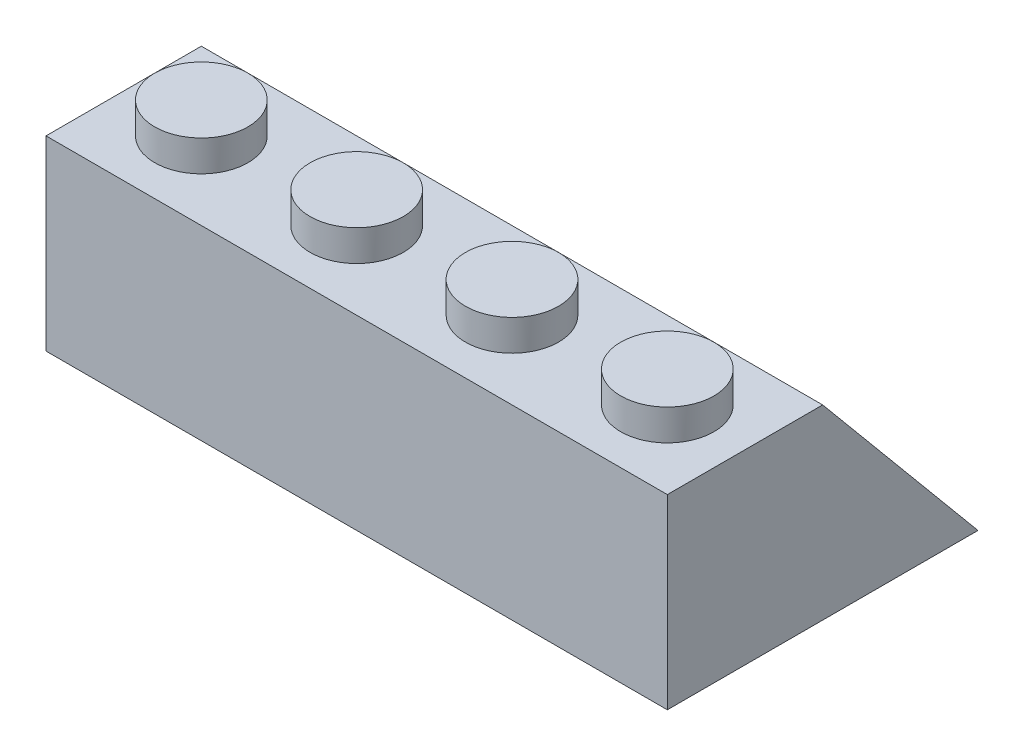
ISO-10303-21;
HEADER;
FILE_DESCRIPTION(('STEP AP214'),'2;1');
FILE_NAME('part.step','',(''),(''),'','','');
FILE_SCHEMA(('AUTOMOTIVE_DESIGN { 1 0 10303 214 1 1 1 1 }'));
ENDSEC;
DATA;
#1=APPLICATION_CONTEXT('core data for automotive mechanical design processes');
#2=APPLICATION_PROTOCOL_DEFINITION('international standard','automotive_design',2000,#1);
#3=PRODUCT_CONTEXT('',#1,'mechanical');
#4=PRODUCT('Part','Part','',(#3));
#5=PRODUCT_RELATED_PRODUCT_CATEGORY('part','',(#4));
#6=PRODUCT_DEFINITION_FORMATION('','',#4);
#7=PRODUCT_DEFINITION_CONTEXT('part definition',#1,'design');
#8=PRODUCT_DEFINITION('design','',#6,#7);
#9=PRODUCT_DEFINITION_SHAPE('','',#8);
#10=(LENGTH_UNIT() NAMED_UNIT(*) SI_UNIT(.MILLI.,.METRE.));
#11=(NAMED_UNIT(*) PLANE_ANGLE_UNIT() SI_UNIT($,.RADIAN.));
#12=(NAMED_UNIT(*) SI_UNIT($,.STERADIAN.) SOLID_ANGLE_UNIT());
#13=UNCERTAINTY_MEASURE_WITH_UNIT(LENGTH_MEASURE(1.E-05),#10,'distance_accuracy_value','');
#14=(GEOMETRIC_REPRESENTATION_CONTEXT(3) GLOBAL_UNCERTAINTY_ASSIGNED_CONTEXT((#13)) GLOBAL_UNIT_ASSIGNED_CONTEXT((#10,
#11,#12)) REPRESENTATION_CONTEXT('',''));
#15=CARTESIAN_POINT('',(0.,0.,0.));
#16=DIRECTION('',(0.,0.,1.));
#17=DIRECTION('',(1.,0.,0.));
#18=AXIS2_PLACEMENT_3D('',#15,#16,#17);
#19=CARTESIAN_POINT('',(32.,0.,0.));
#20=DIRECTION('',(0.,1.,0.));
#21=DIRECTION('',(0.,0.,1.));
#22=AXIS2_PLACEMENT_3D('',#19,#20,#21);
#23=PLANE('',#22);
#24=DIRECTION('',(0.,0.,-1.));
#25=VECTOR('',#24,1.);
#26=CARTESIAN_POINT('',(0.,0.,0.));
#27=LINE('',#26,#25);
#28=CARTESIAN_POINT('',(0.,0.,0.));
#29=VERTEX_POINT('',#28);
#30=CARTESIAN_POINT('',(0.,0.,-16.));
#31=VERTEX_POINT('',#30);
#32=EDGE_CURVE('E198',#29,#31,#27,.T.);
#33=ORIENTED_EDGE('',*,*,#32,.T.);
#34=DIRECTION('',(-1.,0.,0.));
#35=VECTOR('',#34,1.);
#36=CARTESIAN_POINT('',(32.,0.,-16.));
#37=LINE('',#36,#35);
#38=CARTESIAN_POINT('',(32.,0.,-16.));
#39=VERTEX_POINT('',#38);
#40=EDGE_CURVE('E211',#39,#31,#37,.T.);
#41=ORIENTED_EDGE('',*,*,#40,.F.);
#42=DIRECTION('',(0.,0.,-1.));
#43=VECTOR('',#42,1.);
#44=CARTESIAN_POINT('',(32.,0.,0.));
#45=LINE('',#44,#43);
#46=CARTESIAN_POINT('',(32.,0.,0.));
#47=VERTEX_POINT('',#46);
#48=EDGE_CURVE('E92',#47,#39,#45,.T.);
#49=ORIENTED_EDGE('',*,*,#48,.F.);
#50=DIRECTION('',(-1.,0.,0.));
#51=VECTOR('',#50,1.);
#52=CARTESIAN_POINT('',(32.,0.,0.));
#53=LINE('',#52,#51);
#54=EDGE_CURVE('E215',#47,#29,#53,.T.);
#55=ORIENTED_EDGE('',*,*,#54,.T.);
#56=EDGE_LOOP('',(#33,#41,#49,#55));
#57=FACE_BOUND('',#56,.T.);
#58=DIRECTION('',(0.,0.,-1.));
#59=VECTOR('',#58,1.);
#60=CARTESIAN_POINT('',(1.6,0.,0.));
#61=LINE('',#60,#59);
#62=CARTESIAN_POINT('',(1.6,0.,-1.6));
#63=VERTEX_POINT('',#62);
#64=CARTESIAN_POINT('',(1.6,0.,-13.9172667530916));
#65=VERTEX_POINT('',#64);
#66=EDGE_CURVE('E140',#63,#65,#61,.T.);
#67=ORIENTED_EDGE('',*,*,#66,.F.);
#68=DIRECTION('',(-1.,0.,0.));
#69=VECTOR('',#68,1.);
#70=CARTESIAN_POINT('',(32.,0.,-1.6));
#71=LINE('',#70,#69);
#72=CARTESIAN_POINT('',(30.4,0.,-1.6));
#73=VERTEX_POINT('',#72);
#74=EDGE_CURVE('E138',#73,#63,#71,.T.);
#75=ORIENTED_EDGE('',*,*,#74,.F.);
#76=DIRECTION('',(0.,0.,-1.));
#77=VECTOR('',#76,1.);
#78=CARTESIAN_POINT('',(30.4,0.,0.));
#79=LINE('',#78,#77);
#80=CARTESIAN_POINT('',(30.4,0.,-13.9172667530916));
#81=VERTEX_POINT('',#80);
#82=EDGE_CURVE('E155',#73,#81,#79,.T.);
#83=ORIENTED_EDGE('',*,*,#82,.T.);
#84=DIRECTION('',(-1.,0.,0.));
#85=VECTOR('',#84,1.);
#86=CARTESIAN_POINT('',(32.,0.,-13.9172667530916));
#87=LINE('',#86,#85);
#88=EDGE_CURVE('E166',#81,#65,#87,.T.);
#89=ORIENTED_EDGE('',*,*,#88,.T.);
#90=EDGE_LOOP('',(#67,#75,#83,#89));
#91=FACE_BOUND('',#90,.T.);
#92=ADVANCED_FACE('F38',(#57,#91),#23,.F.);
#93=CARTESIAN_POINT('',(28.,11.2,-4.));
#94=DIRECTION('',(0.,1.,0.));
#95=DIRECTION('',(0.,0.,1.));
#96=AXIS2_PLACEMENT_3D('',#93,#94,#95);
#97=PLANE('',#96);
#98=CARTESIAN_POINT('',(28.,11.2,-4.));
#99=DIRECTION('',(0.,1.,0.));
#100=DIRECTION('',(0.,0.,1.));
#101=AXIS2_PLACEMENT_3D('',#98,#99,#100);
#102=CIRCLE('',#101,2.4);
#103=CARTESIAN_POINT('',(28.,11.2,-1.6));
#104=VERTEX_POINT('',#103);
#105=EDGE_CURVE('E11',#104,#104,#102,.T.);
#106=ORIENTED_EDGE('',*,*,#105,.T.);
#107=EDGE_LOOP('',(#106));
#108=FACE_BOUND('',#107,.T.);
#109=ADVANCED_FACE('F40',(#108),#97,.T.);
#110=CARTESIAN_POINT('',(28.,11.2,-4.));
#111=DIRECTION('',(0.,-1.,0.));
#112=DIRECTION('',(0.,0.,-1.));
#113=AXIS2_PLACEMENT_3D('',#110,#111,#112);
#114=CYLINDRICAL_SURFACE('',#113,2.4);
#115=ORIENTED_EDGE('',*,*,#105,.F.);
#116=EDGE_LOOP('',(#115));
#117=FACE_BOUND('',#116,.T.);
#118=CARTESIAN_POINT('',(28.,9.6,-4.));
#119=DIRECTION('',(0.,-1.,0.));
#120=DIRECTION('',(0.,0.,-1.));
#121=AXIS2_PLACEMENT_3D('',#118,#119,#120);
#122=CIRCLE('',#121,2.4);
#123=CARTESIAN_POINT('',(28.,9.6,-6.4));
#124=VERTEX_POINT('',#123);
#125=EDGE_CURVE('E47',#124,#124,#122,.F.);
#126=ORIENTED_EDGE('',*,*,#125,.T.);
#127=EDGE_LOOP('',(#126));
#128=FACE_BOUND('',#127,.T.);
#129=ADVANCED_FACE('F237',(#117,#128),#114,.T.);
#130=CARTESIAN_POINT('',(20.,11.2,-4.));
#131=DIRECTION('',(0.,1.,0.));
#132=DIRECTION('',(0.,0.,1.));
#133=AXIS2_PLACEMENT_3D('',#130,#131,#132);
#134=PLANE('',#133);
#135=CARTESIAN_POINT('',(20.,11.2,-4.));
#136=DIRECTION('',(0.,1.,0.));
#137=DIRECTION('',(0.,0.,1.));
#138=AXIS2_PLACEMENT_3D('',#135,#136,#137);
#139=CIRCLE('',#138,2.4);
#140=CARTESIAN_POINT('',(20.,11.2,-1.6));
#141=VERTEX_POINT('',#140);
#142=EDGE_CURVE('E230',#141,#141,#139,.T.);
#143=ORIENTED_EDGE('',*,*,#142,.T.);
#144=EDGE_LOOP('',(#143));
#145=FACE_BOUND('',#144,.T.);
#146=ADVANCED_FACE('F273',(#145),#134,.T.);
#147=CARTESIAN_POINT('',(20.,11.2,-4.));
#148=DIRECTION('',(0.,-1.,0.));
#149=DIRECTION('',(0.,0.,-1.));
#150=AXIS2_PLACEMENT_3D('',#147,#148,#149);
#151=CYLINDRICAL_SURFACE('',#150,2.4);
#152=ORIENTED_EDGE('',*,*,#142,.F.);
#153=EDGE_LOOP('',(#152));
#154=FACE_BOUND('',#153,.T.);
#155=CARTESIAN_POINT('',(20.,9.6,-4.));
#156=DIRECTION('',(0.,-1.,0.));
#157=DIRECTION('',(0.,0.,-1.));
#158=AXIS2_PLACEMENT_3D('',#155,#156,#157);
#159=CIRCLE('',#158,2.4);
#160=CARTESIAN_POINT('',(20.,9.6,-6.4));
#161=VERTEX_POINT('',#160);
#162=EDGE_CURVE('E226',#161,#161,#159,.F.);
#163=ORIENTED_EDGE('',*,*,#162,.T.);
#164=EDGE_LOOP('',(#163));
#165=FACE_BOUND('',#164,.T.);
#166=ADVANCED_FACE('F269',(#154,#165),#151,.T.);
#167=CARTESIAN_POINT('',(32.,9.6,0.));
#168=DIRECTION('',(0.,0.,-1.));
#169=DIRECTION('',(-1.,0.,0.));
#170=AXIS2_PLACEMENT_3D('',#167,#168,#169);
#171=PLANE('',#170);
#172=DIRECTION('',(0.,-1.,0.));
#173=VECTOR('',#172,1.);
#174=CARTESIAN_POINT('',(0.,9.6,0.));
#175=LINE('',#174,#173);
#176=CARTESIAN_POINT('',(0.,9.6,0.));
#177=VERTEX_POINT('',#176);
#178=EDGE_CURVE('E183',#177,#29,#175,.T.);
#179=ORIENTED_EDGE('',*,*,#178,.T.);
#180=ORIENTED_EDGE('',*,*,#54,.F.);
#181=DIRECTION('',(0.,-1.,0.));
#182=VECTOR('',#181,1.);
#183=CARTESIAN_POINT('',(32.,9.6,0.));
#184=LINE('',#183,#182);
#185=CARTESIAN_POINT('',(32.,9.6,0.));
#186=VERTEX_POINT('',#185);
#187=EDGE_CURVE('E184',#186,#47,#184,.T.);
#188=ORIENTED_EDGE('',*,*,#187,.F.);
#189=DIRECTION('',(-1.,0.,0.));
#190=VECTOR('',#189,1.);
#191=CARTESIAN_POINT('',(32.,9.6,0.));
#192=LINE('',#191,#190);
#193=EDGE_CURVE('E194',#186,#177,#192,.T.);
#194=ORIENTED_EDGE('',*,*,#193,.T.);
#195=EDGE_LOOP('',(#179,#180,#188,#194));
#196=FACE_BOUND('',#195,.T.);
#197=ADVANCED_FACE('F251',(#196),#171,.F.);
#198=CARTESIAN_POINT('',(32.,9.6,-8.));
#199=DIRECTION('',(0.,-0.64018439966448,0.768221279597376));
#200=DIRECTION('',(0.,-0.768221279597376,-0.64018439966448));
#201=AXIS2_PLACEMENT_3D('',#198,#199,#200);
#202=PLANE('',#201);
#203=DIRECTION('',(0.,0.768221279597376,0.64018439966448));
#204=VECTOR('',#203,1.);
#205=CARTESIAN_POINT('',(0.,9.6,-8.));
#206=LINE('',#205,#204);
#207=CARTESIAN_POINT('',(0.,9.6,-8.));
#208=VERTEX_POINT('',#207);
#209=EDGE_CURVE('E201',#31,#208,#206,.T.);
#210=ORIENTED_EDGE('',*,*,#209,.T.);
#211=DIRECTION('',(-1.,0.,0.));
#212=VECTOR('',#211,1.);
#213=CARTESIAN_POINT('',(32.,9.6,-8.));
#214=LINE('',#213,#212);
#215=CARTESIAN_POINT('',(32.,9.6,-8.));
#216=VERTEX_POINT('',#215);
#217=EDGE_CURVE('E208',#216,#208,#214,.T.);
#218=ORIENTED_EDGE('',*,*,#217,.F.);
#219=DIRECTION('',(0.,0.768221279597376,0.64018439966448));
#220=VECTOR('',#219,1.);
#221=CARTESIAN_POINT('',(32.,9.6,-8.));
#222=LINE('',#221,#220);
#223=EDGE_CURVE('E189',#39,#216,#222,.T.);
#224=ORIENTED_EDGE('',*,*,#223,.F.);
#225=ORIENTED_EDGE('',*,*,#40,.T.);
#226=EDGE_LOOP('',(#210,#218,#224,#225));
#227=FACE_BOUND('',#226,.T.);
#228=ADVANCED_FACE('F242',(#227),#202,.F.);
#229=CARTESIAN_POINT('',(32.,9.6,-8.));
#230=DIRECTION('',(0.,-1.,0.));
#231=DIRECTION('',(0.,0.,-1.));
#232=AXIS2_PLACEMENT_3D('',#229,#230,#231);
#233=PLANE('',#232);
#234=CARTESIAN_POINT('',(12.,9.6,-4.));
#235=DIRECTION('',(0.,-1.,0.));
#236=DIRECTION('',(0.,0.,-1.));
#237=AXIS2_PLACEMENT_3D('',#234,#235,#236);
#238=CIRCLE('',#237,2.4);
#239=CARTESIAN_POINT('',(12.,9.6,-6.4));
#240=VERTEX_POINT('',#239);
#241=EDGE_CURVE('E222',#240,#240,#238,.F.);
#242=ORIENTED_EDGE('',*,*,#241,.F.);
#243=EDGE_LOOP('',(#242));
#244=FACE_BOUND('',#243,.T.);
#245=CARTESIAN_POINT('',(4.,9.6,-4.));
#246=DIRECTION('',(0.,-1.,0.));
#247=DIRECTION('',(0.,0.,-1.));
#248=AXIS2_PLACEMENT_3D('',#245,#246,#247);
#249=CIRCLE('',#248,2.4);
#250=CARTESIAN_POINT('',(4.,9.6,-6.4));
#251=VERTEX_POINT('',#250);
#252=EDGE_CURVE('E218',#251,#251,#249,.F.);
#253=ORIENTED_EDGE('',*,*,#252,.F.);
#254=EDGE_LOOP('',(#253));
#255=FACE_BOUND('',#254,.T.);
#256=DIRECTION('',(0.,0.,1.));
#257=VECTOR('',#256,1.);
#258=CARTESIAN_POINT('',(0.,9.6,-8.));
#259=LINE('',#258,#257);
#260=EDGE_CURVE('E84',#208,#177,#259,.T.);
#261=ORIENTED_EDGE('',*,*,#260,.T.);
#262=ORIENTED_EDGE('',*,*,#193,.F.);
#263=DIRECTION('',(0.,0.,1.));
#264=VECTOR('',#263,1.);
#265=CARTESIAN_POINT('',(32.,9.6,-8.));
#266=LINE('',#265,#264);
#267=EDGE_CURVE('E63',#216,#186,#266,.T.);
#268=ORIENTED_EDGE('',*,*,#267,.F.);
#269=ORIENTED_EDGE('',*,*,#217,.T.);
#270=EDGE_LOOP('',(#261,#262,#268,#269));
#271=FACE_BOUND('',#270,.T.);
#272=ORIENTED_EDGE('',*,*,#162,.F.);
#273=EDGE_LOOP('',(#272));
#274=FACE_BOUND('',#273,.T.);
#275=ORIENTED_EDGE('',*,*,#125,.F.);
#276=EDGE_LOOP('',(#275));
#277=FACE_BOUND('',#276,.T.);
#278=ADVANCED_FACE('F239',(#244,#255,#271,#274,#277),#233,.F.);
#279=CARTESIAN_POINT('',(32.,0.,0.));
#280=DIRECTION('',(1.,0.,0.));
#281=DIRECTION('',(0.,0.,-1.));
#282=AXIS2_PLACEMENT_3D('',#279,#280,#281);
#283=PLANE('',#282);
#284=ORIENTED_EDGE('',*,*,#187,.T.);
#285=ORIENTED_EDGE('',*,*,#48,.T.);
#286=ORIENTED_EDGE('',*,*,#223,.T.);
#287=ORIENTED_EDGE('',*,*,#267,.T.);
#288=EDGE_LOOP('',(#284,#285,#286,#287));
#289=FACE_BOUND('',#288,.T.);
#290=ADVANCED_FACE('F241',(#289),#283,.T.);
#291=CARTESIAN_POINT('',(0.,0.,0.));
#292=DIRECTION('',(1.,0.,0.));
#293=DIRECTION('',(0.,0.,-1.));
#294=AXIS2_PLACEMENT_3D('',#291,#292,#293);
#295=PLANE('',#294);
#296=ORIENTED_EDGE('',*,*,#178,.F.);
#297=ORIENTED_EDGE('',*,*,#260,.F.);
#298=ORIENTED_EDGE('',*,*,#209,.F.);
#299=ORIENTED_EDGE('',*,*,#32,.F.);
#300=EDGE_LOOP('',(#296,#297,#298,#299));
#301=FACE_BOUND('',#300,.T.);
#302=ADVANCED_FACE('F249',(#301),#295,.F.);
#303=CARTESIAN_POINT('',(4.,11.2,-4.));
#304=DIRECTION('',(0.,-1.,0.));
#305=DIRECTION('',(0.,0.,-1.));
#306=AXIS2_PLACEMENT_3D('',#303,#304,#305);
#307=CYLINDRICAL_SURFACE('',#306,2.4);
#308=CARTESIAN_POINT('',(4.,11.2,-4.));
#309=DIRECTION('',(0.,1.,0.));
#310=DIRECTION('',(0.,0.,1.));
#311=AXIS2_PLACEMENT_3D('',#308,#309,#310);
#312=CIRCLE('',#311,2.4);
#313=CARTESIAN_POINT('',(4.,11.2,-1.6));
#314=VERTEX_POINT('',#313);
#315=EDGE_CURVE('E178',#314,#314,#312,.T.);
#316=ORIENTED_EDGE('',*,*,#315,.F.);
#317=EDGE_LOOP('',(#316));
#318=FACE_BOUND('',#317,.T.);
#319=ORIENTED_EDGE('',*,*,#252,.T.);
#320=EDGE_LOOP('',(#319));
#321=FACE_BOUND('',#320,.T.);
#322=ADVANCED_FACE('F316',(#318,#321),#307,.T.);
#323=CARTESIAN_POINT('',(4.,11.2,-4.));
#324=DIRECTION('',(0.,1.,0.));
#325=DIRECTION('',(0.,0.,1.));
#326=AXIS2_PLACEMENT_3D('',#323,#324,#325);
#327=PLANE('',#326);
#328=ORIENTED_EDGE('',*,*,#315,.T.);
#329=EDGE_LOOP('',(#328));
#330=FACE_BOUND('',#329,.T.);
#331=ADVANCED_FACE('F325',(#330),#327,.T.);
#332=CARTESIAN_POINT('',(12.,11.2,-4.));
#333=DIRECTION('',(0.,-1.,0.));
#334=DIRECTION('',(0.,0.,-1.));
#335=AXIS2_PLACEMENT_3D('',#332,#333,#334);
#336=CYLINDRICAL_SURFACE('',#335,2.4);
#337=CARTESIAN_POINT('',(12.,11.2,-4.));
#338=DIRECTION('',(0.,1.,0.));
#339=DIRECTION('',(0.,0.,1.));
#340=AXIS2_PLACEMENT_3D('',#337,#338,#339);
#341=CIRCLE('',#340,2.4);
#342=CARTESIAN_POINT('',(12.,11.2,-1.6));
#343=VERTEX_POINT('',#342);
#344=EDGE_CURVE('E174',#343,#343,#341,.T.);
#345=ORIENTED_EDGE('',*,*,#344,.F.);
#346=EDGE_LOOP('',(#345));
#347=FACE_BOUND('',#346,.T.);
#348=ORIENTED_EDGE('',*,*,#241,.T.);
#349=EDGE_LOOP('',(#348));
#350=FACE_BOUND('',#349,.T.);
#351=ADVANCED_FACE('F334',(#347,#350),#336,.T.);
#352=CARTESIAN_POINT('',(12.,11.2,-4.));
#353=DIRECTION('',(0.,1.,0.));
#354=DIRECTION('',(0.,0.,1.));
#355=AXIS2_PLACEMENT_3D('',#352,#353,#354);
#356=PLANE('',#355);
#357=ORIENTED_EDGE('',*,*,#344,.T.);
#358=EDGE_LOOP('',(#357));
#359=FACE_BOUND('',#358,.T.);
#360=ADVANCED_FACE('F356',(#359),#356,.T.);
#361=CARTESIAN_POINT('',(28.,9.6,-4.));
#362=DIRECTION('',(0.,1.,0.));
#363=DIRECTION('',(0.,0.,1.));
#364=AXIS2_PLACEMENT_3D('',#361,#362,#363);
#365=PLANE('',#364);
#366=CARTESIAN_POINT('',(28.,9.6,-4.));
#367=DIRECTION('',(0.,1.,0.));
#368=DIRECTION('',(0.,0.,1.));
#369=AXIS2_PLACEMENT_3D('',#366,#367,#368);
#370=CIRCLE('',#369,0.8);
#371=CARTESIAN_POINT('',(28.,9.6,-3.2));
#372=VERTEX_POINT('',#371);
#373=EDGE_CURVE('E179',#372,#372,#370,.T.);
#374=ORIENTED_EDGE('',*,*,#373,.F.);
#375=EDGE_LOOP('',(#374));
#376=FACE_BOUND('',#375,.T.);
#377=ADVANCED_FACE('F363',(#376),#365,.F.);
#378=CARTESIAN_POINT('',(28.,11.2,-4.));
#379=DIRECTION('',(0.,-1.,0.));
#380=DIRECTION('',(0.,0.,-1.));
#381=AXIS2_PLACEMENT_3D('',#378,#379,#380);
#382=CYLINDRICAL_SURFACE('',#381,0.8);
#383=ORIENTED_EDGE('',*,*,#373,.T.);
#384=EDGE_LOOP('',(#383));
#385=FACE_BOUND('',#384,.T.);
#386=CARTESIAN_POINT('',(28.,8.,-4.));
#387=DIRECTION('',(0.,-1.,0.));
#388=DIRECTION('',(0.,0.,-1.));
#389=AXIS2_PLACEMENT_3D('',#386,#387,#388);
#390=CIRCLE('',#389,0.8);
#391=CARTESIAN_POINT('',(28.,8.,-4.8));
#392=VERTEX_POINT('',#391);
#393=EDGE_CURVE('E508',#392,#392,#390,.F.);
#394=ORIENTED_EDGE('',*,*,#393,.F.);
#395=EDGE_LOOP('',(#394));
#396=FACE_BOUND('',#395,.T.);
#397=ADVANCED_FACE('F376',(#385,#396),#382,.F.);
#398=CARTESIAN_POINT('',(20.,9.6,-4.));
#399=DIRECTION('',(0.,1.,0.));
#400=DIRECTION('',(0.,0.,1.));
#401=AXIS2_PLACEMENT_3D('',#398,#399,#400);
#402=PLANE('',#401);
#403=CARTESIAN_POINT('',(20.,9.6,-4.));
#404=DIRECTION('',(0.,1.,0.));
#405=DIRECTION('',(0.,0.,1.));
#406=AXIS2_PLACEMENT_3D('',#403,#404,#405);
#407=CIRCLE('',#406,0.8);
#408=CARTESIAN_POINT('',(20.,9.6,-3.2));
#409=VERTEX_POINT('',#408);
#410=EDGE_CURVE('E151',#409,#409,#407,.T.);
#411=ORIENTED_EDGE('',*,*,#410,.F.);
#412=EDGE_LOOP('',(#411));
#413=FACE_BOUND('',#412,.T.);
#414=ADVANCED_FACE('F386',(#413),#402,.F.);
#415=CARTESIAN_POINT('',(20.,11.2,-4.));
#416=DIRECTION('',(0.,-1.,0.));
#417=DIRECTION('',(0.,0.,-1.));
#418=AXIS2_PLACEMENT_3D('',#415,#416,#417);
#419=CYLINDRICAL_SURFACE('',#418,0.8);
#420=ORIENTED_EDGE('',*,*,#410,.T.);
#421=EDGE_LOOP('',(#420));
#422=FACE_BOUND('',#421,.T.);
#423=CARTESIAN_POINT('',(20.,8.,-4.));
#424=DIRECTION('',(0.,-1.,0.));
#425=DIRECTION('',(0.,0.,-1.));
#426=AXIS2_PLACEMENT_3D('',#423,#424,#425);
#427=CIRCLE('',#426,0.8);
#428=CARTESIAN_POINT('',(20.,8.,-4.8));
#429=VERTEX_POINT('',#428);
#430=EDGE_CURVE('E500',#429,#429,#427,.F.);
#431=ORIENTED_EDGE('',*,*,#430,.F.);
#432=EDGE_LOOP('',(#431));
#433=FACE_BOUND('',#432,.T.);
#434=ADVANCED_FACE('F396',(#422,#433),#419,.F.);
#435=CARTESIAN_POINT('',(32.,9.6,-1.6));
#436=DIRECTION('',(0.,0.,-1.));
#437=DIRECTION('',(-1.,0.,0.));
#438=AXIS2_PLACEMENT_3D('',#435,#436,#437);
#439=PLANE('',#438);
#440=DIRECTION('',(0.,-1.,0.));
#441=VECTOR('',#440,1.);
#442=CARTESIAN_POINT('',(1.6,9.6,-1.6));
#443=LINE('',#442,#441);
#444=CARTESIAN_POINT('',(1.6,8.,-1.6));
#445=VERTEX_POINT('',#444);
#446=EDGE_CURVE('E119',#445,#63,#443,.T.);
#447=ORIENTED_EDGE('',*,*,#446,.F.);
#448=DIRECTION('',(-1.,0.,0.));
#449=VECTOR('',#448,1.);
#450=CARTESIAN_POINT('',(32.,8.,-1.6));
#451=LINE('',#450,#449);
#452=CARTESIAN_POINT('',(30.4,8.,-1.6));
#453=VERTEX_POINT('',#452);
#454=EDGE_CURVE('E128',#453,#445,#451,.T.);
#455=ORIENTED_EDGE('',*,*,#454,.F.);
#456=DIRECTION('',(0.,-1.,0.));
#457=VECTOR('',#456,1.);
#458=CARTESIAN_POINT('',(30.4,9.6,-1.6));
#459=LINE('',#458,#457);
#460=EDGE_CURVE('E54',#453,#73,#459,.T.);
#461=ORIENTED_EDGE('',*,*,#460,.T.);
#462=ORIENTED_EDGE('',*,*,#74,.T.);
#463=EDGE_LOOP('',(#447,#455,#461,#462));
#464=FACE_BOUND('',#463,.T.);
#465=ADVANCED_FACE('F136',(#464),#439,.T.);
#466=CARTESIAN_POINT('',(32.,8.57570496053683,-6.7708459526442));
#467=DIRECTION('',(0.,-0.64018439966448,0.768221279597376));
#468=DIRECTION('',(0.,-0.768221279597376,-0.64018439966448));
#469=AXIS2_PLACEMENT_3D('',#466,#467,#468);
#470=PLANE('',#469);
#471=DIRECTION('',(0.,0.768221279597376,0.64018439966448));
#472=VECTOR('',#471,1.);
#473=CARTESIAN_POINT('',(1.6,8.57570496053683,-6.7708459526442));
#474=LINE('',#473,#472);
#475=CARTESIAN_POINT('',(1.6,8.,-7.25060008642489));
#476=VERTEX_POINT('',#475);
#477=EDGE_CURVE('E122',#65,#476,#474,.T.);
#478=ORIENTED_EDGE('',*,*,#477,.F.);
#479=ORIENTED_EDGE('',*,*,#88,.F.);
#480=DIRECTION('',(0.,0.768221279597376,0.64018439966448));
#481=VECTOR('',#480,1.);
#482=CARTESIAN_POINT('',(30.4,8.57570496053683,-6.7708459526442));
#483=LINE('',#482,#481);
#484=CARTESIAN_POINT('',(30.4,8.,-7.25060008642489));
#485=VERTEX_POINT('',#484);
#486=EDGE_CURVE('E156',#81,#485,#483,.T.);
#487=ORIENTED_EDGE('',*,*,#486,.T.);
#488=DIRECTION('',(-1.,0.,0.));
#489=VECTOR('',#488,1.);
#490=CARTESIAN_POINT('',(32.,8.,-7.25060008642489));
#491=LINE('',#490,#489);
#492=EDGE_CURVE('E134',#485,#476,#491,.T.);
#493=ORIENTED_EDGE('',*,*,#492,.T.);
#494=EDGE_LOOP('',(#478,#479,#487,#493));
#495=FACE_BOUND('',#494,.T.);
#496=ADVANCED_FACE('F415',(#495),#470,.T.);
#497=CARTESIAN_POINT('',(32.,8.,-8.));
#498=DIRECTION('',(0.,-1.,0.));
#499=DIRECTION('',(0.,0.,-1.));
#500=AXIS2_PLACEMENT_3D('',#497,#498,#499);
#501=PLANE('',#500);
#502=CARTESIAN_POINT('',(12.,8.,-4.));
#503=DIRECTION('',(0.,-1.,0.));
#504=DIRECTION('',(0.,0.,-1.));
#505=AXIS2_PLACEMENT_3D('',#502,#503,#504);
#506=CIRCLE('',#505,0.8);
#507=CARTESIAN_POINT('',(12.,8.,-4.8));
#508=VERTEX_POINT('',#507);
#509=EDGE_CURVE('E498',#508,#508,#506,.F.);
#510=ORIENTED_EDGE('',*,*,#509,.T.);
#511=EDGE_LOOP('',(#510));
#512=FACE_BOUND('',#511,.T.);
#513=CARTESIAN_POINT('',(4.,8.,-4.));
#514=DIRECTION('',(0.,-1.,0.));
#515=DIRECTION('',(0.,0.,-1.));
#516=AXIS2_PLACEMENT_3D('',#513,#514,#515);
#517=CIRCLE('',#516,0.8);
#518=CARTESIAN_POINT('',(4.,8.,-4.8));
#519=VERTEX_POINT('',#518);
#520=EDGE_CURVE('E165',#519,#519,#517,.F.);
#521=ORIENTED_EDGE('',*,*,#520,.T.);
#522=EDGE_LOOP('',(#521));
#523=FACE_BOUND('',#522,.T.);
#524=DIRECTION('',(0.,0.,1.));
#525=VECTOR('',#524,1.);
#526=CARTESIAN_POINT('',(1.6,8.,-8.));
#527=LINE('',#526,#525);
#528=EDGE_CURVE('E115',#476,#445,#527,.T.);
#529=ORIENTED_EDGE('',*,*,#528,.F.);
#530=ORIENTED_EDGE('',*,*,#492,.F.);
#531=DIRECTION('',(0.,0.,1.));
#532=VECTOR('',#531,1.);
#533=CARTESIAN_POINT('',(30.4,8.,-8.));
#534=LINE('',#533,#532);
#535=EDGE_CURVE('E132',#485,#453,#534,.T.);
#536=ORIENTED_EDGE('',*,*,#535,.T.);
#537=ORIENTED_EDGE('',*,*,#454,.T.);
#538=EDGE_LOOP('',(#529,#530,#536,#537));
#539=FACE_BOUND('',#538,.T.);
#540=ORIENTED_EDGE('',*,*,#430,.T.);
#541=EDGE_LOOP('',(#540));
#542=FACE_BOUND('',#541,.T.);
#543=ORIENTED_EDGE('',*,*,#393,.T.);
#544=EDGE_LOOP('',(#543));
#545=FACE_BOUND('',#544,.T.);
#546=ADVANCED_FACE('F129',(#512,#523,#539,#542,#545),#501,.T.);
#547=CARTESIAN_POINT('',(30.4,0.,0.));
#548=DIRECTION('',(1.,0.,0.));
#549=DIRECTION('',(0.,0.,-1.));
#550=AXIS2_PLACEMENT_3D('',#547,#548,#549);
#551=PLANE('',#550);
#552=ORIENTED_EDGE('',*,*,#460,.F.);
#553=ORIENTED_EDGE('',*,*,#535,.F.);
#554=ORIENTED_EDGE('',*,*,#486,.F.);
#555=ORIENTED_EDGE('',*,*,#82,.F.);
#556=EDGE_LOOP('',(#552,#553,#554,#555));
#557=FACE_BOUND('',#556,.T.);
#558=ADVANCED_FACE('F433',(#557),#551,.F.);
#559=CARTESIAN_POINT('',(1.6,0.,0.));
#560=DIRECTION('',(1.,0.,0.));
#561=DIRECTION('',(0.,0.,-1.));
#562=AXIS2_PLACEMENT_3D('',#559,#560,#561);
#563=PLANE('',#562);
#564=ORIENTED_EDGE('',*,*,#446,.T.);
#565=ORIENTED_EDGE('',*,*,#66,.T.);
#566=ORIENTED_EDGE('',*,*,#477,.T.);
#567=ORIENTED_EDGE('',*,*,#528,.T.);
#568=EDGE_LOOP('',(#564,#565,#566,#567));
#569=FACE_BOUND('',#568,.T.);
#570=ADVANCED_FACE('F117',(#569),#563,.T.);
#571=CARTESIAN_POINT('',(4.,11.2,-4.));
#572=DIRECTION('',(0.,-1.,0.));
#573=DIRECTION('',(0.,0.,-1.));
#574=AXIS2_PLACEMENT_3D('',#571,#572,#573);
#575=CYLINDRICAL_SURFACE('',#574,0.8);
#576=CARTESIAN_POINT('',(4.,9.6,-4.));
#577=DIRECTION('',(0.,1.,0.));
#578=DIRECTION('',(0.,0.,1.));
#579=AXIS2_PLACEMENT_3D('',#576,#577,#578);
#580=CIRCLE('',#579,0.8);
#581=CARTESIAN_POINT('',(4.,9.6,-3.2));
#582=VERTEX_POINT('',#581);
#583=EDGE_CURVE('E141',#582,#582,#580,.T.);
#584=ORIENTED_EDGE('',*,*,#583,.T.);
#585=EDGE_LOOP('',(#584));
#586=FACE_BOUND('',#585,.T.);
#587=ORIENTED_EDGE('',*,*,#520,.F.);
#588=EDGE_LOOP('',(#587));
#589=FACE_BOUND('',#588,.T.);
#590=ADVANCED_FACE('F452',(#586,#589),#575,.F.);
#591=CARTESIAN_POINT('',(4.,9.6,-4.));
#592=DIRECTION('',(0.,1.,0.));
#593=DIRECTION('',(0.,0.,1.));
#594=AXIS2_PLACEMENT_3D('',#591,#592,#593);
#595=PLANE('',#594);
#596=ORIENTED_EDGE('',*,*,#583,.F.);
#597=EDGE_LOOP('',(#596));
#598=FACE_BOUND('',#597,.T.);
#599=ADVANCED_FACE('F461',(#598),#595,.F.);
#600=CARTESIAN_POINT('',(12.,11.2,-4.));
#601=DIRECTION('',(0.,-1.,0.));
#602=DIRECTION('',(0.,0.,-1.));
#603=AXIS2_PLACEMENT_3D('',#600,#601,#602);
#604=CYLINDRICAL_SURFACE('',#603,0.8);
#605=CARTESIAN_POINT('',(12.,9.6,-4.));
#606=DIRECTION('',(0.,1.,0.));
#607=DIRECTION('',(0.,0.,1.));
#608=AXIS2_PLACEMENT_3D('',#605,#606,#607);
#609=CIRCLE('',#608,0.8);
#610=CARTESIAN_POINT('',(12.,9.6,-3.2));
#611=VERTEX_POINT('',#610);
#612=EDGE_CURVE('E147',#611,#611,#609,.T.);
#613=ORIENTED_EDGE('',*,*,#612,.T.);
#614=EDGE_LOOP('',(#613));
#615=FACE_BOUND('',#614,.T.);
#616=ORIENTED_EDGE('',*,*,#509,.F.);
#617=EDGE_LOOP('',(#616));
#618=FACE_BOUND('',#617,.T.);
#619=ADVANCED_FACE('F471',(#615,#618),#604,.F.);
#620=CARTESIAN_POINT('',(12.,9.6,-4.));
#621=DIRECTION('',(0.,1.,0.));
#622=DIRECTION('',(0.,0.,1.));
#623=AXIS2_PLACEMENT_3D('',#620,#621,#622);
#624=PLANE('',#623);
#625=ORIENTED_EDGE('',*,*,#612,.F.);
#626=EDGE_LOOP('',(#625));
#627=FACE_BOUND('',#626,.T.);
#628=ADVANCED_FACE('F481',(#627),#624,.F.);
#629=CLOSED_SHELL('',(#92,#109,#129,#146,#166,#197,#228,#278,#290,#302,#322,#331,#351,#360,#377,
#397,#414,#434,#465,#496,#546,#558,#570,#590,#599,#619,#628));
#630=MANIFOLD_SOLID_BREP('B2',#629);
#631=ADVANCED_BREP_SHAPE_REPRESENTATION('',(#18,#630),#14);
#632=SHAPE_DEFINITION_REPRESENTATION(#9,#631);
ENDSEC;
END-ISO-10303-21;
